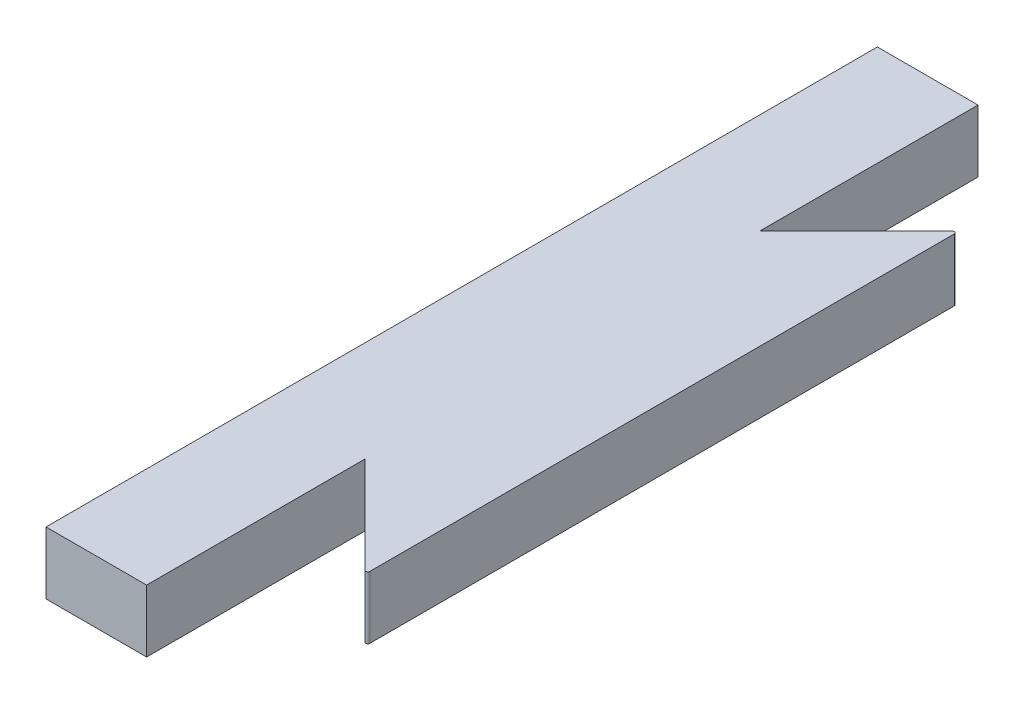
ISO-10303-21;
HEADER;
FILE_DESCRIPTION(('STEP AP214'),'2;1');
FILE_NAME('part.step','',(''),(''),'','','');
FILE_SCHEMA(('AUTOMOTIVE_DESIGN { 1 0 10303 214 1 1 1 1 }'));
ENDSEC;
DATA;
#1=APPLICATION_CONTEXT('core data for automotive mechanical design processes');
#2=APPLICATION_PROTOCOL_DEFINITION('international standard','automotive_design',2000,#1);
#3=PRODUCT_CONTEXT('',#1,'mechanical');
#4=PRODUCT('Part','Part','',(#3));
#5=PRODUCT_RELATED_PRODUCT_CATEGORY('part','',(#4));
#6=PRODUCT_DEFINITION_FORMATION('','',#4);
#7=PRODUCT_DEFINITION_CONTEXT('part definition',#1,'design');
#8=PRODUCT_DEFINITION('design','',#6,#7);
#9=PRODUCT_DEFINITION_SHAPE('','',#8);
#10=(LENGTH_UNIT() NAMED_UNIT(*) SI_UNIT(.MILLI.,.METRE.));
#11=(NAMED_UNIT(*) PLANE_ANGLE_UNIT() SI_UNIT($,.RADIAN.));
#12=(NAMED_UNIT(*) SI_UNIT($,.STERADIAN.) SOLID_ANGLE_UNIT());
#13=UNCERTAINTY_MEASURE_WITH_UNIT(LENGTH_MEASURE(1.E-05),#10,'distance_accuracy_value','');
#14=(GEOMETRIC_REPRESENTATION_CONTEXT(3) GLOBAL_UNCERTAINTY_ASSIGNED_CONTEXT((#13)) GLOBAL_UNIT_ASSIGNED_CONTEXT((#10,
#11,#12)) REPRESENTATION_CONTEXT('',''));
#15=CARTESIAN_POINT('',(0.,0.,0.));
#16=DIRECTION('',(0.,0.,1.));
#17=DIRECTION('',(1.,0.,0.));
#18=AXIS2_PLACEMENT_3D('',#15,#16,#17);
#19=CARTESIAN_POINT('',(0.,3.,0.));
#20=DIRECTION('',(0.,-1.,0.));
#21=DIRECTION('',(0.,0.,-1.));
#22=AXIS2_PLACEMENT_3D('',#19,#20,#21);
#23=PLANE('',#22);
#24=DIRECTION('',(0.,0.,-1.));
#25=VECTOR('',#24,1.);
#26=CARTESIAN_POINT('',(69.8,3.,-14.3));
#27=LINE('',#26,#25);
#28=CARTESIAN_POINT('',(69.8,3.,14.0585786437627));
#29=VERTEX_POINT('',#28);
#30=CARTESIAN_POINT('',(69.8,3.,-14.0585786437627));
#31=VERTEX_POINT('',#30);
#32=EDGE_CURVE('E151',#29,#31,#27,.T.);
#33=ORIENTED_EDGE('',*,*,#32,.T.);
#34=CARTESIAN_POINT('',(69.7,3.,-14.0585786437627));
#35=DIRECTION('',(0.,-1.,0.));
#36=DIRECTION('',(0.,0.,-1.));
#37=AXIS2_PLACEMENT_3D('',#34,#35,#36);
#38=CIRCLE('',#37,0.1);
#39=CARTESIAN_POINT('',(69.6292893218813,3.,-14.1292893218813));
#40=VERTEX_POINT('',#39);
#41=EDGE_CURVE('E47',#31,#40,#38,.F.);
#42=ORIENTED_EDGE('',*,*,#41,.T.);
#43=DIRECTION('',(-0.707106781186549,0.,0.707106781186546));
#44=VECTOR('',#43,1.);
#45=CARTESIAN_POINT('',(65.,3.,-9.50000000000002));
#46=LINE('',#45,#44);
#47=CARTESIAN_POINT('',(65.,3.,-9.50000000000002));
#48=VERTEX_POINT('',#47);
#49=EDGE_CURVE('E153',#40,#48,#46,.T.);
#50=ORIENTED_EDGE('',*,*,#49,.T.);
#51=DIRECTION('',(0.,0.,-1.));
#52=VECTOR('',#51,1.);
#53=CARTESIAN_POINT('',(65.,3.,-9.50000000000002));
#54=LINE('',#53,#52);
#55=CARTESIAN_POINT('',(65.,3.,-20.));
#56=VERTEX_POINT('',#55);
#57=EDGE_CURVE('E146',#48,#56,#54,.T.);
#58=ORIENTED_EDGE('',*,*,#57,.T.);
#59=DIRECTION('',(-1.,0.,0.));
#60=VECTOR('',#59,1.);
#61=CARTESIAN_POINT('',(-65.,3.,-20.));
#62=LINE('',#61,#60);
#63=CARTESIAN_POINT('',(60.1586584021932,3.,-20.));
#64=VERTEX_POINT('',#63);
#65=EDGE_CURVE('E135',#56,#64,#62,.T.);
#66=ORIENTED_EDGE('',*,*,#65,.T.);
#67=DIRECTION('',(0.,0.,-1.));
#68=VECTOR('',#67,1.);
#69=CARTESIAN_POINT('',(60.1586584021932,3.,0.));
#70=LINE('',#69,#68);
#71=CARTESIAN_POINT('',(60.1586584021932,3.,20.));
#72=VERTEX_POINT('',#71);
#73=EDGE_CURVE('E120',#72,#64,#70,.T.);
#74=ORIENTED_EDGE('',*,*,#73,.F.);
#75=DIRECTION('',(1.,0.,0.));
#76=VECTOR('',#75,1.);
#77=CARTESIAN_POINT('',(-65.,3.,20.));
#78=LINE('',#77,#76);
#79=CARTESIAN_POINT('',(65.,3.,20.));
#80=VERTEX_POINT('',#79);
#81=EDGE_CURVE('E132',#72,#80,#78,.T.);
#82=ORIENTED_EDGE('',*,*,#81,.T.);
#83=DIRECTION('',(0.,0.,-1.));
#84=VECTOR('',#83,1.);
#85=CARTESIAN_POINT('',(65.,3.,20.));
#86=LINE('',#85,#84);
#87=CARTESIAN_POINT('',(65.,3.,9.50000000000002));
#88=VERTEX_POINT('',#87);
#89=EDGE_CURVE('E142',#80,#88,#86,.T.);
#90=ORIENTED_EDGE('',*,*,#89,.T.);
#91=DIRECTION('',(0.707106781186549,0.,0.707106781186546));
#92=VECTOR('',#91,1.);
#93=CARTESIAN_POINT('',(69.8,3.,14.3));
#94=LINE('',#93,#92);
#95=CARTESIAN_POINT('',(69.6292893218813,3.,14.1292893218813));
#96=VERTEX_POINT('',#95);
#97=EDGE_CURVE('E144',#88,#96,#94,.T.);
#98=ORIENTED_EDGE('',*,*,#97,.T.);
#99=CARTESIAN_POINT('',(69.7,3.,14.0585786437627));
#100=DIRECTION('',(0.,-1.,0.));
#101=DIRECTION('',(0.,0.,-1.));
#102=AXIS2_PLACEMENT_3D('',#99,#100,#101);
#103=CIRCLE('',#102,0.1);
#104=EDGE_CURVE('E190',#96,#29,#103,.F.);
#105=ORIENTED_EDGE('',*,*,#104,.T.);
#106=EDGE_LOOP('',(#33,#42,#50,#58,#66,#74,#82,#90,#98,#105));
#107=FACE_BOUND('',#106,.T.);
#108=ADVANCED_FACE('F39',(#107),#23,.F.);
#109=CARTESIAN_POINT('',(0.,0.,0.));
#110=DIRECTION('',(0.,-1.,0.));
#111=DIRECTION('',(0.,0.,-1.));
#112=AXIS2_PLACEMENT_3D('',#109,#110,#111);
#113=PLANE('',#112);
#114=DIRECTION('',(-0.707106781186549,0.,0.707106781186546));
#115=VECTOR('',#114,1.);
#116=CARTESIAN_POINT('',(65.,0.,-9.50000000000002));
#117=LINE('',#116,#115);
#118=CARTESIAN_POINT('',(69.6292893218813,0.,-14.1292893218813));
#119=VERTEX_POINT('',#118);
#120=CARTESIAN_POINT('',(65.,0.,-9.50000000000002));
#121=VERTEX_POINT('',#120);
#122=EDGE_CURVE('E170',#119,#121,#117,.T.);
#123=ORIENTED_EDGE('',*,*,#122,.F.);
#124=CARTESIAN_POINT('',(69.7,0.,-14.0585786437627));
#125=DIRECTION('',(0.,-1.,0.));
#126=DIRECTION('',(0.,0.,-1.));
#127=AXIS2_PLACEMENT_3D('',#124,#125,#126);
#128=CIRCLE('',#127,0.1);
#129=CARTESIAN_POINT('',(69.8,0.,-14.0585786437627));
#130=VERTEX_POINT('',#129);
#131=EDGE_CURVE('E184',#119,#130,#128,.T.);
#132=ORIENTED_EDGE('',*,*,#131,.T.);
#133=DIRECTION('',(0.,0.,-1.));
#134=VECTOR('',#133,1.);
#135=CARTESIAN_POINT('',(69.8,0.,-14.3));
#136=LINE('',#135,#134);
#137=CARTESIAN_POINT('',(69.8,0.,14.0585786437627));
#138=VERTEX_POINT('',#137);
#139=EDGE_CURVE('E168',#138,#130,#136,.T.);
#140=ORIENTED_EDGE('',*,*,#139,.F.);
#141=CARTESIAN_POINT('',(69.7,0.,14.0585786437627));
#142=DIRECTION('',(0.,-1.,0.));
#143=DIRECTION('',(0.,0.,-1.));
#144=AXIS2_PLACEMENT_3D('',#141,#142,#143);
#145=CIRCLE('',#144,0.1);
#146=CARTESIAN_POINT('',(69.6292893218813,0.,14.1292893218813));
#147=VERTEX_POINT('',#146);
#148=EDGE_CURVE('E182',#138,#147,#145,.T.);
#149=ORIENTED_EDGE('',*,*,#148,.T.);
#150=DIRECTION('',(0.707106781186549,0.,0.707106781186546));
#151=VECTOR('',#150,1.);
#152=CARTESIAN_POINT('',(69.8,0.,14.3));
#153=LINE('',#152,#151);
#154=CARTESIAN_POINT('',(65.,0.,9.50000000000002));
#155=VERTEX_POINT('',#154);
#156=EDGE_CURVE('E166',#155,#147,#153,.T.);
#157=ORIENTED_EDGE('',*,*,#156,.F.);
#158=DIRECTION('',(0.,0.,-1.));
#159=VECTOR('',#158,1.);
#160=CARTESIAN_POINT('',(65.,0.,20.));
#161=LINE('',#160,#159);
#162=CARTESIAN_POINT('',(65.,0.,20.));
#163=VERTEX_POINT('',#162);
#164=EDGE_CURVE('E164',#163,#155,#161,.T.);
#165=ORIENTED_EDGE('',*,*,#164,.F.);
#166=DIRECTION('',(1.,0.,0.));
#167=VECTOR('',#166,1.);
#168=CARTESIAN_POINT('',(-65.,0.,20.));
#169=LINE('',#168,#167);
#170=CARTESIAN_POINT('',(60.1586584021932,0.,20.));
#171=VERTEX_POINT('',#170);
#172=EDGE_CURVE('E162',#171,#163,#169,.T.);
#173=ORIENTED_EDGE('',*,*,#172,.F.);
#174=DIRECTION('',(0.,0.,-1.));
#175=VECTOR('',#174,1.);
#176=CARTESIAN_POINT('',(60.1586584021932,0.,0.));
#177=LINE('',#176,#175);
#178=CARTESIAN_POINT('',(60.1586584021932,0.,-20.));
#179=VERTEX_POINT('',#178);
#180=EDGE_CURVE('E123',#171,#179,#177,.T.);
#181=ORIENTED_EDGE('',*,*,#180,.T.);
#182=DIRECTION('',(-1.,0.,0.));
#183=VECTOR('',#182,1.);
#184=CARTESIAN_POINT('',(-65.,0.,-20.));
#185=LINE('',#184,#183);
#186=CARTESIAN_POINT('',(65.,0.,-20.));
#187=VERTEX_POINT('',#186);
#188=EDGE_CURVE('E159',#187,#179,#185,.T.);
#189=ORIENTED_EDGE('',*,*,#188,.F.);
#190=DIRECTION('',(0.,0.,-1.));
#191=VECTOR('',#190,1.);
#192=CARTESIAN_POINT('',(65.,0.,-9.50000000000002));
#193=LINE('',#192,#191);
#194=EDGE_CURVE('E156',#121,#187,#193,.T.);
#195=ORIENTED_EDGE('',*,*,#194,.F.);
#196=EDGE_LOOP('',(#123,#132,#140,#149,#157,#165,#173,#181,#189,#195));
#197=FACE_BOUND('',#196,.T.);
#198=ADVANCED_FACE('F203',(#197),#113,.T.);
#199=CARTESIAN_POINT('',(-65.,3.,-20.));
#200=DIRECTION('',(0.,0.,1.));
#201=DIRECTION('',(1.,0.,0.));
#202=AXIS2_PLACEMENT_3D('',#199,#200,#201);
#203=PLANE('',#202);
#204=DIRECTION('',(0.,-1.,0.));
#205=VECTOR('',#204,1.);
#206=CARTESIAN_POINT('',(60.1586584021932,3.,-20.));
#207=LINE('',#206,#205);
#208=EDGE_CURVE('E136',#64,#179,#207,.T.);
#209=ORIENTED_EDGE('',*,*,#208,.F.);
#210=ORIENTED_EDGE('',*,*,#65,.F.);
#211=DIRECTION('',(0.,-1.,0.));
#212=VECTOR('',#211,1.);
#213=CARTESIAN_POINT('',(65.,3.,-20.));
#214=LINE('',#213,#212);
#215=EDGE_CURVE('E128',#56,#187,#214,.T.);
#216=ORIENTED_EDGE('',*,*,#215,.T.);
#217=ORIENTED_EDGE('',*,*,#188,.T.);
#218=EDGE_LOOP('',(#209,#210,#216,#217));
#219=FACE_BOUND('',#218,.T.);
#220=ADVANCED_FACE('F217',(#219),#203,.F.);
#221=CARTESIAN_POINT('',(-65.,3.,20.));
#222=DIRECTION('',(0.,0.,-1.));
#223=DIRECTION('',(-1.,0.,0.));
#224=AXIS2_PLACEMENT_3D('',#221,#222,#223);
#225=PLANE('',#224);
#226=DIRECTION('',(0.,1.,0.));
#227=VECTOR('',#226,1.);
#228=CARTESIAN_POINT('',(60.1586584021932,3.,20.));
#229=LINE('',#228,#227);
#230=EDGE_CURVE('E117',#171,#72,#229,.T.);
#231=ORIENTED_EDGE('',*,*,#230,.F.);
#232=ORIENTED_EDGE('',*,*,#172,.T.);
#233=DIRECTION('',(0.,-1.,0.));
#234=VECTOR('',#233,1.);
#235=CARTESIAN_POINT('',(65.,3.,20.));
#236=LINE('',#235,#234);
#237=EDGE_CURVE('E140',#80,#163,#236,.T.);
#238=ORIENTED_EDGE('',*,*,#237,.F.);
#239=ORIENTED_EDGE('',*,*,#81,.F.);
#240=EDGE_LOOP('',(#231,#232,#238,#239));
#241=FACE_BOUND('',#240,.T.);
#242=ADVANCED_FACE('F138',(#241),#225,.F.);
#243=CARTESIAN_POINT('',(65.,3.,-9.50000000000002));
#244=DIRECTION('',(-1.,0.,0.));
#245=DIRECTION('',(0.,0.,1.));
#246=AXIS2_PLACEMENT_3D('',#243,#244,#245);
#247=PLANE('',#246);
#248=ORIENTED_EDGE('',*,*,#194,.T.);
#249=ORIENTED_EDGE('',*,*,#215,.F.);
#250=ORIENTED_EDGE('',*,*,#57,.F.);
#251=DIRECTION('',(0.,-1.,0.));
#252=VECTOR('',#251,1.);
#253=CARTESIAN_POINT('',(65.,3.,-9.50000000000002));
#254=LINE('',#253,#252);
#255=EDGE_CURVE('E155',#48,#121,#254,.T.);
#256=ORIENTED_EDGE('',*,*,#255,.T.);
#257=EDGE_LOOP('',(#248,#249,#250,#256));
#258=FACE_BOUND('',#257,.T.);
#259=ADVANCED_FACE('F220',(#258),#247,.F.);
#260=CARTESIAN_POINT('',(65.,3.,20.));
#261=DIRECTION('',(-1.,0.,0.));
#262=DIRECTION('',(0.,0.,1.));
#263=AXIS2_PLACEMENT_3D('',#260,#261,#262);
#264=PLANE('',#263);
#265=ORIENTED_EDGE('',*,*,#164,.T.);
#266=DIRECTION('',(0.,-1.,0.));
#267=VECTOR('',#266,1.);
#268=CARTESIAN_POINT('',(65.,3.,9.50000000000002));
#269=LINE('',#268,#267);
#270=EDGE_CURVE('E174',#88,#155,#269,.T.);
#271=ORIENTED_EDGE('',*,*,#270,.F.);
#272=ORIENTED_EDGE('',*,*,#89,.F.);
#273=ORIENTED_EDGE('',*,*,#237,.T.);
#274=EDGE_LOOP('',(#265,#271,#272,#273));
#275=FACE_BOUND('',#274,.T.);
#276=ADVANCED_FACE('F214',(#275),#264,.F.);
#277=CARTESIAN_POINT('',(69.8,3.,14.3));
#278=DIRECTION('',(0.707106781186546,0.,-0.707106781186549));
#279=DIRECTION('',(-0.707106781186549,0.,-0.707106781186546));
#280=AXIS2_PLACEMENT_3D('',#277,#278,#279);
#281=PLANE('',#280);
#282=ORIENTED_EDGE('',*,*,#156,.T.);
#283=DIRECTION('',(0.,-1.,0.));
#284=VECTOR('',#283,1.);
#285=CARTESIAN_POINT('',(69.6292893218813,3.,14.1292893218813));
#286=LINE('',#285,#284);
#287=EDGE_CURVE('E11',#147,#96,#286,.F.);
#288=ORIENTED_EDGE('',*,*,#287,.T.);
#289=ORIENTED_EDGE('',*,*,#97,.F.);
#290=ORIENTED_EDGE('',*,*,#270,.T.);
#291=EDGE_LOOP('',(#282,#288,#289,#290));
#292=FACE_BOUND('',#291,.T.);
#293=ADVANCED_FACE('F211',(#292),#281,.F.);
#294=CARTESIAN_POINT('',(69.8,3.,-14.3));
#295=DIRECTION('',(-1.,0.,0.));
#296=DIRECTION('',(0.,0.,1.));
#297=AXIS2_PLACEMENT_3D('',#294,#295,#296);
#298=PLANE('',#297);
#299=ORIENTED_EDGE('',*,*,#139,.T.);
#300=DIRECTION('',(0.,-1.,0.));
#301=VECTOR('',#300,1.);
#302=CARTESIAN_POINT('',(69.8,3.,-14.0585786437627));
#303=LINE('',#302,#301);
#304=EDGE_CURVE('E60',#130,#31,#303,.F.);
#305=ORIENTED_EDGE('',*,*,#304,.T.);
#306=ORIENTED_EDGE('',*,*,#32,.F.);
#307=DIRECTION('',(0.,-1.,0.));
#308=VECTOR('',#307,1.);
#309=CARTESIAN_POINT('',(69.8,3.,14.0585786437627));
#310=LINE('',#309,#308);
#311=EDGE_CURVE('E186',#29,#138,#310,.T.);
#312=ORIENTED_EDGE('',*,*,#311,.T.);
#313=EDGE_LOOP('',(#299,#305,#306,#312));
#314=FACE_BOUND('',#313,.T.);
#315=ADVANCED_FACE('F205',(#314),#298,.F.);
#316=CARTESIAN_POINT('',(65.,3.,-9.50000000000002));
#317=DIRECTION('',(0.707106781186546,0.,0.707106781186549));
#318=DIRECTION('',(0.707106781186549,0.,-0.707106781186546));
#319=AXIS2_PLACEMENT_3D('',#316,#317,#318);
#320=PLANE('',#319);
#321=ORIENTED_EDGE('',*,*,#49,.F.);
#322=DIRECTION('',(0.,-1.,0.));
#323=VECTOR('',#322,1.);
#324=CARTESIAN_POINT('',(69.6292893218813,3.,-14.1292893218813));
#325=LINE('',#324,#323);
#326=EDGE_CURVE('E127',#40,#119,#325,.T.);
#327=ORIENTED_EDGE('',*,*,#326,.T.);
#328=ORIENTED_EDGE('',*,*,#122,.T.);
#329=ORIENTED_EDGE('',*,*,#255,.F.);
#330=EDGE_LOOP('',(#321,#327,#328,#329));
#331=FACE_BOUND('',#330,.T.);
#332=ADVANCED_FACE('F197',(#331),#320,.F.);
#333=CARTESIAN_POINT('',(60.1586584021932,13.,-28.3979676669156));
#334=DIRECTION('',(-1.,0.,0.));
#335=DIRECTION('',(0.,0.,1.));
#336=AXIS2_PLACEMENT_3D('',#333,#334,#335);
#337=PLANE('',#336);
#338=ORIENTED_EDGE('',*,*,#208,.T.);
#339=ORIENTED_EDGE('',*,*,#180,.F.);
#340=ORIENTED_EDGE('',*,*,#230,.T.);
#341=ORIENTED_EDGE('',*,*,#73,.T.);
#342=EDGE_LOOP('',(#338,#339,#340,#341));
#343=FACE_BOUND('',#342,.T.);
#344=ADVANCED_FACE('F119',(#343),#337,.T.);
#345=CARTESIAN_POINT('',(69.7,3.,-14.0585786437627));
#346=DIRECTION('',(0.,-1.,0.));
#347=DIRECTION('',(0.,0.,-1.));
#348=AXIS2_PLACEMENT_3D('',#345,#346,#347);
#349=CYLINDRICAL_SURFACE('',#348,0.1);
#350=ORIENTED_EDGE('',*,*,#41,.F.);
#351=ORIENTED_EDGE('',*,*,#304,.F.);
#352=ORIENTED_EDGE('',*,*,#131,.F.);
#353=ORIENTED_EDGE('',*,*,#326,.F.);
#354=EDGE_LOOP('',(#350,#351,#352,#353));
#355=FACE_BOUND('',#354,.T.);
#356=ADVANCED_FACE('F200',(#355),#349,.T.);
#357=CARTESIAN_POINT('',(69.7,3.,14.0585786437627));
#358=DIRECTION('',(0.,-1.,0.));
#359=DIRECTION('',(0.,0.,-1.));
#360=AXIS2_PLACEMENT_3D('',#357,#358,#359);
#361=CYLINDRICAL_SURFACE('',#360,0.1);
#362=ORIENTED_EDGE('',*,*,#104,.F.);
#363=ORIENTED_EDGE('',*,*,#287,.F.);
#364=ORIENTED_EDGE('',*,*,#148,.F.);
#365=ORIENTED_EDGE('',*,*,#311,.F.);
#366=EDGE_LOOP('',(#362,#363,#364,#365));
#367=FACE_BOUND('',#366,.T.);
#368=ADVANCED_FACE('F41',(#367),#361,.T.);
#369=CLOSED_SHELL('',(#108,#198,#220,#242,#259,#276,#293,#315,#332,#344,#356,#368));
#370=MANIFOLD_SOLID_BREP('B2',#369);
#371=ADVANCED_BREP_SHAPE_REPRESENTATION('',(#18,#370),#14);
#372=SHAPE_DEFINITION_REPRESENTATION(#9,#371);
ENDSEC;
END-ISO-10303-21;
